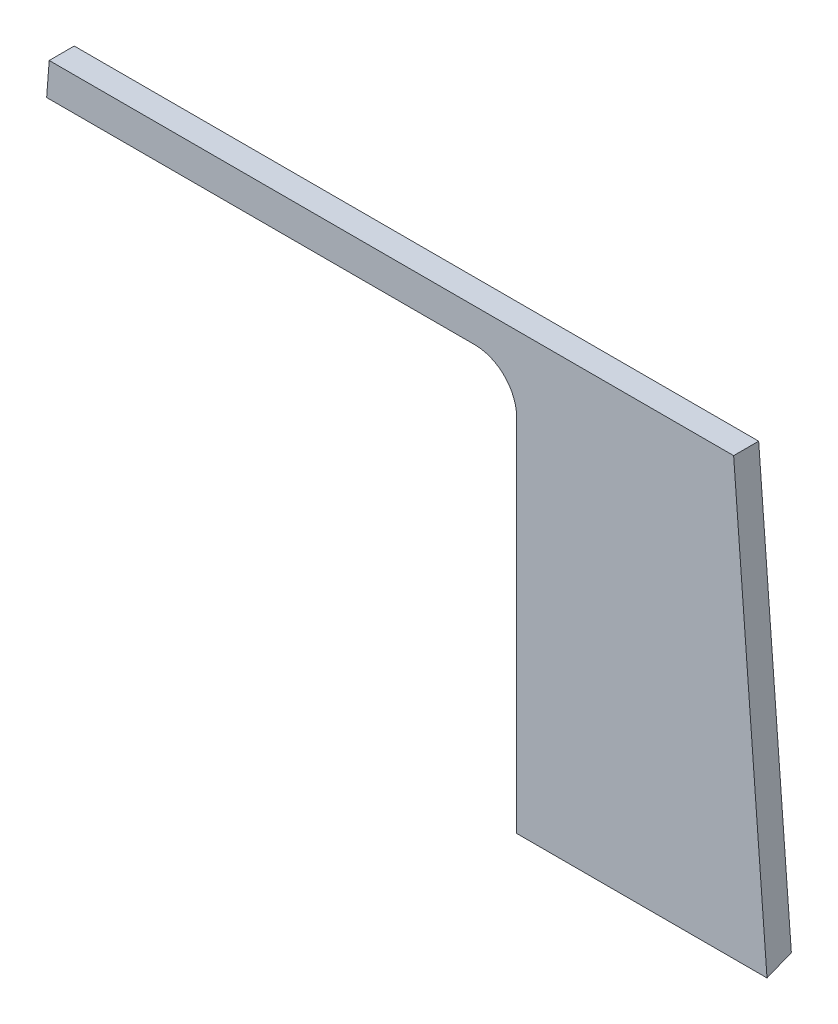
ISO-10303-21;
HEADER;
FILE_DESCRIPTION(('STEP AP214'),'2;1');
FILE_NAME('part.step','',(''),(''),'','','');
FILE_SCHEMA(('AUTOMOTIVE_DESIGN { 1 0 10303 214 1 1 1 1 }'));
ENDSEC;
DATA;
#1=APPLICATION_CONTEXT('core data for automotive mechanical design processes');
#2=APPLICATION_PROTOCOL_DEFINITION('international standard','automotive_design',2000,#1);
#3=PRODUCT_CONTEXT('',#1,'mechanical');
#4=PRODUCT('Part','Part','',(#3));
#5=PRODUCT_RELATED_PRODUCT_CATEGORY('part','',(#4));
#6=PRODUCT_DEFINITION_FORMATION('','',#4);
#7=PRODUCT_DEFINITION_CONTEXT('part definition',#1,'design');
#8=PRODUCT_DEFINITION('design','',#6,#7);
#9=PRODUCT_DEFINITION_SHAPE('','',#8);
#10=(LENGTH_UNIT() NAMED_UNIT(*) SI_UNIT(.MILLI.,.METRE.));
#11=(NAMED_UNIT(*) PLANE_ANGLE_UNIT() SI_UNIT($,.RADIAN.));
#12=(NAMED_UNIT(*) SI_UNIT($,.STERADIAN.) SOLID_ANGLE_UNIT());
#13=UNCERTAINTY_MEASURE_WITH_UNIT(LENGTH_MEASURE(1.E-05),#10,'distance_accuracy_value','');
#14=(GEOMETRIC_REPRESENTATION_CONTEXT(3) GLOBAL_UNCERTAINTY_ASSIGNED_CONTEXT((#13)) GLOBAL_UNIT_ASSIGNED_CONTEXT((#10,
#11,#12)) REPRESENTATION_CONTEXT('',''));
#15=CARTESIAN_POINT('',(0.,0.,0.));
#16=DIRECTION('',(0.,0.,1.));
#17=DIRECTION('',(1.,0.,0.));
#18=AXIS2_PLACEMENT_3D('',#15,#16,#17);
#19=CARTESIAN_POINT('',(41.,52.2,1.5));
#20=DIRECTION('',(-0.997076914575251,-0.0764043612701342,0.));
#21=DIRECTION('',(0.0764043612701343,-0.997076914575251,0.));
#22=AXIS2_PLACEMENT_3D('',#19,#20,#21);
#23=PLANE('',#22);
#24=DIRECTION('',(-0.0764043612701343,0.997076914575251,0.));
#25=VECTOR('',#24,1.);
#26=CARTESIAN_POINT('',(41.,52.2,1.5));
#27=LINE('',#26,#25);
#28=CARTESIAN_POINT('',(45.,0.,1.5));
#29=VERTEX_POINT('',#28);
#30=CARTESIAN_POINT('',(41.,52.2,1.5));
#31=VERTEX_POINT('',#30);
#32=EDGE_CURVE('E143',#29,#31,#27,.T.);
#33=ORIENTED_EDGE('',*,*,#32,.F.);
#34=DIRECTION('',(0.0261994436786969,-0.341902740006994,0.939370057818875));
#35=VECTOR('',#34,1.);
#36=CARTESIAN_POINT('',(44.9382230235834,0.806189542236483,-0.714987563095184));
#37=LINE('',#36,#35);
#38=CARTESIAN_POINT('',(44.9163286817779,1.09191070279861,-1.5));
#39=VERTEX_POINT('',#38);
#40=EDGE_CURVE('E117',#29,#39,#37,.F.);
#41=ORIENTED_EDGE('',*,*,#40,.T.);
#42=DIRECTION('',(-0.0764043612701343,0.997076914575251,0.));
#43=VECTOR('',#42,1.);
#44=CARTESIAN_POINT('',(41.,52.2,-1.5));
#45=LINE('',#44,#43);
#46=CARTESIAN_POINT('',(41.,52.2,-1.5));
#47=VERTEX_POINT('',#46);
#48=EDGE_CURVE('E133',#39,#47,#45,.T.);
#49=ORIENTED_EDGE('',*,*,#48,.T.);
#50=DIRECTION('',(0.,0.,-1.));
#51=VECTOR('',#50,1.);
#52=CARTESIAN_POINT('',(41.,52.2,1.5));
#53=LINE('',#52,#51);
#54=EDGE_CURVE('E126',#31,#47,#53,.T.);
#55=ORIENTED_EDGE('',*,*,#54,.F.);
#56=EDGE_LOOP('',(#33,#41,#49,#55));
#57=FACE_BOUND('',#56,.T.);
#58=ADVANCED_FACE('F40',(#57),#23,.F.);
#59=CARTESIAN_POINT('',(-41.,52.2,1.5));
#60=DIRECTION('',(0.,-1.,0.));
#61=DIRECTION('',(0.,0.,-1.));
#62=AXIS2_PLACEMENT_3D('',#59,#60,#61);
#63=PLANE('',#62);
#64=DIRECTION('',(-1.,0.,0.));
#65=VECTOR('',#64,1.);
#66=CARTESIAN_POINT('',(-41.,52.2,-1.5));
#67=LINE('',#66,#65);
#68=CARTESIAN_POINT('',(-41.,52.2,-1.5));
#69=VERTEX_POINT('',#68);
#70=EDGE_CURVE('E136',#47,#69,#67,.T.);
#71=ORIENTED_EDGE('',*,*,#70,.T.);
#72=DIRECTION('',(0.,0.,-1.));
#73=VECTOR('',#72,1.);
#74=CARTESIAN_POINT('',(-41.,52.2,1.5));
#75=LINE('',#74,#73);
#76=CARTESIAN_POINT('',(-41.,52.2,1.5));
#77=VERTEX_POINT('',#76);
#78=EDGE_CURVE('E120',#77,#69,#75,.T.);
#79=ORIENTED_EDGE('',*,*,#78,.F.);
#80=DIRECTION('',(-1.,0.,0.));
#81=VECTOR('',#80,1.);
#82=CARTESIAN_POINT('',(-41.,52.2,1.5));
#83=LINE('',#82,#81);
#84=EDGE_CURVE('E129',#31,#77,#83,.T.);
#85=ORIENTED_EDGE('',*,*,#84,.F.);
#86=ORIENTED_EDGE('',*,*,#54,.T.);
#87=EDGE_LOOP('',(#71,#79,#85,#86));
#88=FACE_BOUND('',#87,.T.);
#89=ADVANCED_FACE('F180',(#88),#63,.F.);
#90=CARTESIAN_POINT('',(-45.,0.,1.5));
#91=DIRECTION('',(0.997076914575251,-0.0764043612701342,0.));
#92=DIRECTION('',(0.0764043612701343,0.997076914575251,0.));
#93=AXIS2_PLACEMENT_3D('',#90,#91,#92);
#94=PLANE('',#93);
#95=DIRECTION('',(-0.0764043612701343,-0.997076914575251,0.));
#96=VECTOR('',#95,1.);
#97=CARTESIAN_POINT('',(-45.,0.,-1.5));
#98=LINE('',#97,#96);
#99=CARTESIAN_POINT('',(-41.3065134099617,48.2,-1.5));
#100=VERTEX_POINT('',#99);
#101=EDGE_CURVE('E140',#69,#100,#98,.T.);
#102=ORIENTED_EDGE('',*,*,#101,.T.);
#103=DIRECTION('',(0.,0.,1.));
#104=VECTOR('',#103,1.);
#105=CARTESIAN_POINT('',(-41.3065134099617,48.2,1.5));
#106=LINE('',#105,#104);
#107=CARTESIAN_POINT('',(-41.3065134099617,48.2,1.5));
#108=VERTEX_POINT('',#107);
#109=EDGE_CURVE('E137',#100,#108,#106,.T.);
#110=ORIENTED_EDGE('',*,*,#109,.T.);
#111=DIRECTION('',(-0.0764043612701343,-0.997076914575251,0.));
#112=VECTOR('',#111,1.);
#113=CARTESIAN_POINT('',(-45.,0.,1.5));
#114=LINE('',#113,#112);
#115=EDGE_CURVE('E121',#77,#108,#114,.T.);
#116=ORIENTED_EDGE('',*,*,#115,.F.);
#117=ORIENTED_EDGE('',*,*,#78,.T.);
#118=EDGE_LOOP('',(#102,#110,#116,#117));
#119=FACE_BOUND('',#118,.T.);
#120=ADVANCED_FACE('F184',(#119),#94,.F.);
#121=CARTESIAN_POINT('',(0.,0.,1.5));
#122=DIRECTION('',(0.,0.,1.));
#123=DIRECTION('',(1.,0.,0.));
#124=AXIS2_PLACEMENT_3D('',#121,#122,#123);
#125=PLANE('',#124);
#126=DIRECTION('',(-1.,0.,0.));
#127=VECTOR('',#126,1.);
#128=CARTESIAN_POINT('',(-45.,48.2,1.5));
#129=LINE('',#128,#127);
#130=CARTESIAN_POINT('',(9.99999999999999,48.2,1.5));
#131=VERTEX_POINT('',#130);
#132=EDGE_CURVE('E114',#131,#108,#129,.T.);
#133=ORIENTED_EDGE('',*,*,#132,.F.);
#134=CARTESIAN_POINT('',(9.99999999999999,43.2,1.5));
#135=DIRECTION('',(0.,0.,1.));
#136=DIRECTION('',(1.,0.,0.));
#137=AXIS2_PLACEMENT_3D('',#134,#135,#136);
#138=CIRCLE('',#137,5.);
#139=CARTESIAN_POINT('',(15.,43.2,1.5));
#140=VERTEX_POINT('',#139);
#141=EDGE_CURVE('E49',#131,#140,#138,.F.);
#142=ORIENTED_EDGE('',*,*,#141,.T.);
#143=DIRECTION('',(0.,1.,0.));
#144=VECTOR('',#143,1.);
#145=CARTESIAN_POINT('',(15.,0.,1.5));
#146=LINE('',#145,#144);
#147=CARTESIAN_POINT('',(15.,0.,1.5));
#148=VERTEX_POINT('',#147);
#149=EDGE_CURVE('E99',#148,#140,#146,.T.);
#150=ORIENTED_EDGE('',*,*,#149,.F.);
#151=DIRECTION('',(1.,0.,0.));
#152=VECTOR('',#151,1.);
#153=CARTESIAN_POINT('',(-45.,0.,1.5));
#154=LINE('',#153,#152);
#155=EDGE_CURVE('E111',#148,#29,#154,.T.);
#156=ORIENTED_EDGE('',*,*,#155,.T.);
#157=ORIENTED_EDGE('',*,*,#32,.T.);
#158=ORIENTED_EDGE('',*,*,#84,.T.);
#159=ORIENTED_EDGE('',*,*,#115,.T.);
#160=EDGE_LOOP('',(#133,#142,#150,#156,#157,#158,#159));
#161=FACE_BOUND('',#160,.T.);
#162=ADVANCED_FACE('F109',(#161),#125,.T.);
#163=CARTESIAN_POINT('',(0.,0.,-1.5));
#164=DIRECTION('',(0.,0.,1.));
#165=DIRECTION('',(1.,0.,0.));
#166=AXIS2_PLACEMENT_3D('',#163,#164,#165);
#167=PLANE('',#166);
#168=DIRECTION('',(0.,1.,0.));
#169=VECTOR('',#168,1.);
#170=CARTESIAN_POINT('',(15.,0.,-1.5));
#171=LINE('',#170,#169);
#172=CARTESIAN_POINT('',(15.,1.09191070279861,-1.5));
#173=VERTEX_POINT('',#172);
#174=CARTESIAN_POINT('',(15.,43.2,-1.5));
#175=VERTEX_POINT('',#174);
#176=EDGE_CURVE('E100',#173,#175,#171,.T.);
#177=ORIENTED_EDGE('',*,*,#176,.T.);
#178=CARTESIAN_POINT('',(9.99999999999999,43.2,-1.5));
#179=DIRECTION('',(0.,0.,1.));
#180=DIRECTION('',(1.,0.,0.));
#181=AXIS2_PLACEMENT_3D('',#178,#179,#180);
#182=CIRCLE('',#181,5.);
#183=CARTESIAN_POINT('',(9.99999999999999,48.2,-1.5));
#184=VERTEX_POINT('',#183);
#185=EDGE_CURVE('E11',#175,#184,#182,.T.);
#186=ORIENTED_EDGE('',*,*,#185,.T.);
#187=DIRECTION('',(-1.,0.,0.));
#188=VECTOR('',#187,1.);
#189=CARTESIAN_POINT('',(-45.,48.2,-1.5));
#190=LINE('',#189,#188);
#191=EDGE_CURVE('E163',#184,#100,#190,.T.);
#192=ORIENTED_EDGE('',*,*,#191,.T.);
#193=ORIENTED_EDGE('',*,*,#101,.F.);
#194=ORIENTED_EDGE('',*,*,#70,.F.);
#195=ORIENTED_EDGE('',*,*,#48,.F.);
#196=DIRECTION('',(-1.,0.,0.));
#197=VECTOR('',#196,1.);
#198=CARTESIAN_POINT('',(0.,1.09191070279861,-1.5));
#199=LINE('',#198,#197);
#200=EDGE_CURVE('E107',#39,#173,#199,.T.);
#201=ORIENTED_EDGE('',*,*,#200,.T.);
#202=EDGE_LOOP('',(#177,#186,#192,#193,#194,#195,#201));
#203=FACE_BOUND('',#202,.T.);
#204=ADVANCED_FACE('F186',(#203),#167,.F.);
#205=CARTESIAN_POINT('',(-45.,0.,1.5));
#206=DIRECTION('',(0.,0.939692620785908,0.34202014332567));
#207=DIRECTION('',(1.,0.,0.));
#208=AXIS2_PLACEMENT_3D('',#205,#206,#207);
#209=PLANE('',#208);
#210=DIRECTION('',(0.,0.34202014332567,-0.939692620785908));
#211=VECTOR('',#210,1.);
#212=CARTESIAN_POINT('',(15.,0.,1.5));
#213=LINE('',#212,#211);
#214=EDGE_CURVE('E97',#173,#148,#213,.F.);
#215=ORIENTED_EDGE('',*,*,#214,.F.);
#216=ORIENTED_EDGE('',*,*,#200,.F.);
#217=ORIENTED_EDGE('',*,*,#40,.F.);
#218=ORIENTED_EDGE('',*,*,#155,.F.);
#219=EDGE_LOOP('',(#215,#216,#217,#218));
#220=FACE_BOUND('',#219,.T.);
#221=ADVANCED_FACE('F116',(#220),#209,.F.);
#222=CARTESIAN_POINT('',(-45.,48.2,-1.5));
#223=DIRECTION('',(0.,1.,0.));
#224=DIRECTION('',(0.,0.,1.));
#225=AXIS2_PLACEMENT_3D('',#222,#223,#224);
#226=PLANE('',#225);
#227=ORIENTED_EDGE('',*,*,#191,.F.);
#228=DIRECTION('',(0.,0.,1.));
#229=VECTOR('',#228,1.);
#230=CARTESIAN_POINT('',(9.99999999999999,48.2,1.5));
#231=LINE('',#230,#229);
#232=EDGE_CURVE('E106',#184,#131,#231,.T.);
#233=ORIENTED_EDGE('',*,*,#232,.T.);
#234=ORIENTED_EDGE('',*,*,#132,.T.);
#235=ORIENTED_EDGE('',*,*,#109,.F.);
#236=EDGE_LOOP('',(#227,#233,#234,#235));
#237=FACE_BOUND('',#236,.T.);
#238=ADVANCED_FACE('F160',(#237),#226,.F.);
#239=CARTESIAN_POINT('',(15.,0.,-1.5));
#240=DIRECTION('',(1.,0.,0.));
#241=DIRECTION('',(0.,0.,-1.));
#242=AXIS2_PLACEMENT_3D('',#239,#240,#241);
#243=PLANE('',#242);
#244=ORIENTED_EDGE('',*,*,#149,.T.);
#245=DIRECTION('',(0.,0.,1.));
#246=VECTOR('',#245,1.);
#247=CARTESIAN_POINT('',(15.,43.2,-1.5));
#248=LINE('',#247,#246);
#249=EDGE_CURVE('E56',#140,#175,#248,.F.);
#250=ORIENTED_EDGE('',*,*,#249,.T.);
#251=ORIENTED_EDGE('',*,*,#176,.F.);
#252=ORIENTED_EDGE('',*,*,#214,.T.);
#253=EDGE_LOOP('',(#244,#250,#251,#252));
#254=FACE_BOUND('',#253,.T.);
#255=ADVANCED_FACE('F98',(#254),#243,.F.);
#256=CARTESIAN_POINT('',(9.99999999999999,43.2,-1.5));
#257=DIRECTION('',(0.,0.,-1.));
#258=DIRECTION('',(-1.,0.,0.));
#259=AXIS2_PLACEMENT_3D('',#256,#257,#258);
#260=CYLINDRICAL_SURFACE('',#259,5.);
#261=ORIENTED_EDGE('',*,*,#185,.F.);
#262=ORIENTED_EDGE('',*,*,#249,.F.);
#263=ORIENTED_EDGE('',*,*,#141,.F.);
#264=ORIENTED_EDGE('',*,*,#232,.F.);
#265=EDGE_LOOP('',(#261,#262,#263,#264));
#266=FACE_BOUND('',#265,.T.);
#267=ADVANCED_FACE('F42',(#266),#260,.F.);
#268=CLOSED_SHELL('',(#58,#89,#120,#162,#204,#221,#238,#255,#267));
#269=MANIFOLD_SOLID_BREP('B2',#268);
#270=ADVANCED_BREP_SHAPE_REPRESENTATION('',(#18,#269),#14);
#271=SHAPE_DEFINITION_REPRESENTATION(#9,#270);
ENDSEC;
END-ISO-10303-21;
